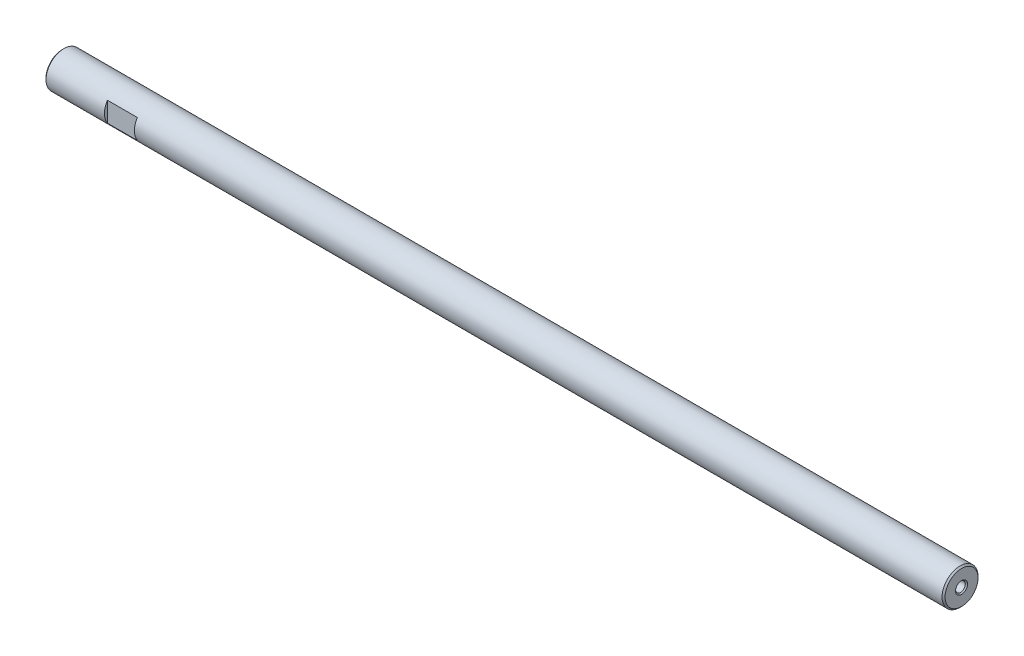
ISO-10303-21;
HEADER;
FILE_DESCRIPTION(('STEP AP214'),'2;1');
FILE_NAME('part.step','',(''),(''),'','','');
FILE_SCHEMA(('AUTOMOTIVE_DESIGN { 1 0 10303 214 1 1 1 1 }'));
ENDSEC;
DATA;
#1=APPLICATION_CONTEXT('core data for automotive mechanical design processes');
#2=APPLICATION_PROTOCOL_DEFINITION('international standard','automotive_design',2000,#1);
#3=PRODUCT_CONTEXT('',#1,'mechanical');
#4=PRODUCT('Part','Part','',(#3));
#5=PRODUCT_RELATED_PRODUCT_CATEGORY('part','',(#4));
#6=PRODUCT_DEFINITION_FORMATION('','',#4);
#7=PRODUCT_DEFINITION_CONTEXT('part definition',#1,'design');
#8=PRODUCT_DEFINITION('design','',#6,#7);
#9=PRODUCT_DEFINITION_SHAPE('','',#8);
#10=(LENGTH_UNIT() NAMED_UNIT(*) SI_UNIT(.MILLI.,.METRE.));
#11=(NAMED_UNIT(*) PLANE_ANGLE_UNIT() SI_UNIT($,.RADIAN.));
#12=(NAMED_UNIT(*) SI_UNIT($,.STERADIAN.) SOLID_ANGLE_UNIT());
#13=UNCERTAINTY_MEASURE_WITH_UNIT(LENGTH_MEASURE(1.E-05),#10,'distance_accuracy_value','');
#14=(GEOMETRIC_REPRESENTATION_CONTEXT(3) GLOBAL_UNCERTAINTY_ASSIGNED_CONTEXT((#13)) GLOBAL_UNIT_ASSIGNED_CONTEXT((#10,
#11,#12)) REPRESENTATION_CONTEXT('',''));
#15=CARTESIAN_POINT('',(0.,0.,0.));
#16=DIRECTION('',(0.,0.,1.));
#17=DIRECTION('',(1.,0.,0.));
#18=AXIS2_PLACEMENT_3D('',#15,#16,#17);
#19=CARTESIAN_POINT('',(300.,5.5,0.));
#20=DIRECTION('',(-1.,0.,0.));
#21=DIRECTION('',(0.,0.,1.));
#22=AXIS2_PLACEMENT_3D('',#19,#20,#21);
#23=PLANE('',#22);
#24=CARTESIAN_POINT('',(300.,0.,0.));
#25=DIRECTION('',(-1.,0.,0.));
#26=DIRECTION('',(0.,0.,1.));
#27=AXIS2_PLACEMENT_3D('',#24,#25,#26);
#28=CIRCLE('',#27,5.5);
#29=CARTESIAN_POINT('',(300.,0.,5.5));
#30=VERTEX_POINT('',#29);
#31=EDGE_CURVE('E118',#30,#30,#28,.T.);
#32=ORIENTED_EDGE('',*,*,#31,.F.);
#33=EDGE_LOOP('',(#32));
#34=FACE_BOUND('',#33,.T.);
#35=CARTESIAN_POINT('',(300.,0.,0.));
#36=DIRECTION('',(-1.,0.,0.));
#37=DIRECTION('',(0.,0.,1.));
#38=AXIS2_PLACEMENT_3D('',#35,#36,#37);
#39=CIRCLE('',#38,2.);
#40=CARTESIAN_POINT('',(300.,0.,2.));
#41=VERTEX_POINT('',#40);
#42=EDGE_CURVE('E106',#41,#41,#39,.T.);
#43=ORIENTED_EDGE('',*,*,#42,.T.);
#44=EDGE_LOOP('',(#43));
#45=FACE_BOUND('',#44,.T.);
#46=ADVANCED_FACE('F17',(#34,#45),#23,.F.);
#47=CARTESIAN_POINT('',(0.,0.,0.));
#48=DIRECTION('',(1.,0.,0.));
#49=DIRECTION('',(0.,0.,-1.));
#50=AXIS2_PLACEMENT_3D('',#47,#48,#49);
#51=PLANE('',#50);
#52=CARTESIAN_POINT('',(0.,0.,0.));
#53=DIRECTION('',(-1.,0.,0.));
#54=DIRECTION('',(0.,0.,1.));
#55=AXIS2_PLACEMENT_3D('',#52,#53,#54);
#56=CIRCLE('',#55,5.5);
#57=CARTESIAN_POINT('',(0.,0.,5.5));
#58=VERTEX_POINT('',#57);
#59=EDGE_CURVE('E72',#58,#58,#56,.T.);
#60=ORIENTED_EDGE('',*,*,#59,.T.);
#61=EDGE_LOOP('',(#60));
#62=FACE_BOUND('',#61,.T.);
#63=CARTESIAN_POINT('',(0.,0.,0.));
#64=DIRECTION('',(-1.,0.,0.));
#65=DIRECTION('',(0.,-1.,0.));
#66=AXIS2_PLACEMENT_3D('',#63,#64,#65);
#67=CIRCLE('',#66,2.);
#68=CARTESIAN_POINT('',(0.,-2.,0.));
#69=VERTEX_POINT('',#68);
#70=EDGE_CURVE('E115',#69,#69,#67,.T.);
#71=ORIENTED_EDGE('',*,*,#70,.F.);
#72=EDGE_LOOP('',(#71));
#73=FACE_BOUND('',#72,.T.);
#74=ADVANCED_FACE('F19',(#62,#73),#51,.F.);
#75=CARTESIAN_POINT('',(0.5,0.,0.));
#76=DIRECTION('',(1.,0.,0.));
#77=DIRECTION('',(0.,0.,-1.));
#78=AXIS2_PLACEMENT_3D('',#75,#76,#77);
#79=CONICAL_SURFACE('',#78,6.,0.785398163397448);
#80=ORIENTED_EDGE('',*,*,#59,.F.);
#81=EDGE_LOOP('',(#80));
#82=FACE_BOUND('',#81,.T.);
#83=CARTESIAN_POINT('',(0.5,0.,0.));
#84=DIRECTION('',(-1.,0.,0.));
#85=DIRECTION('',(0.,0.,1.));
#86=AXIS2_PLACEMENT_3D('',#83,#84,#85);
#87=CIRCLE('',#86,6.);
#88=CARTESIAN_POINT('',(0.5,0.,6.));
#89=VERTEX_POINT('',#88);
#90=EDGE_CURVE('E124',#89,#89,#87,.T.);
#91=ORIENTED_EDGE('',*,*,#90,.T.);
#92=EDGE_LOOP('',(#91));
#93=FACE_BOUND('',#92,.T.);
#94=ADVANCED_FACE('F132',(#82,#93),#79,.T.);
#95=CARTESIAN_POINT('',(300.,0.,0.));
#96=DIRECTION('',(-1.,0.,0.));
#97=DIRECTION('',(0.,0.,1.));
#98=AXIS2_PLACEMENT_3D('',#95,#96,#97);
#99=CYLINDRICAL_SURFACE('',#98,6.);
#100=CARTESIAN_POINT('',(30.,0.,0.));
#101=DIRECTION('',(1.,0.,0.));
#102=DIRECTION('',(0.,0.,-1.));
#103=AXIS2_PLACEMENT_3D('',#100,#101,#102);
#104=CIRCLE('',#103,6.);
#105=CARTESIAN_POINT('',(30.,-3.3166247903554,-5.));
#106=VERTEX_POINT('',#105);
#107=CARTESIAN_POINT('',(30.,3.3166247903554,-5.));
#108=VERTEX_POINT('',#107);
#109=EDGE_CURVE('E25',#106,#108,#104,.T.);
#110=ORIENTED_EDGE('',*,*,#109,.T.);
#111=DIRECTION('',(-1.,0.,0.));
#112=VECTOR('',#111,1.);
#113=CARTESIAN_POINT('',(300.,3.3166247903554,-5.));
#114=LINE('',#113,#112);
#115=CARTESIAN_POINT('',(20.,3.3166247903554,-5.));
#116=VERTEX_POINT('',#115);
#117=EDGE_CURVE('E11',#108,#116,#114,.T.);
#118=ORIENTED_EDGE('',*,*,#117,.T.);
#119=CARTESIAN_POINT('',(20.,0.,0.));
#120=DIRECTION('',(1.,0.,0.));
#121=DIRECTION('',(0.,0.,-1.));
#122=AXIS2_PLACEMENT_3D('',#119,#120,#121);
#123=CIRCLE('',#122,6.);
#124=CARTESIAN_POINT('',(20.,-3.3166247903554,-5.));
#125=VERTEX_POINT('',#124);
#126=EDGE_CURVE('E83',#125,#116,#123,.T.);
#127=ORIENTED_EDGE('',*,*,#126,.F.);
#128=DIRECTION('',(-1.,0.,0.));
#129=VECTOR('',#128,1.);
#130=CARTESIAN_POINT('',(300.,-3.3166247903554,-5.));
#131=LINE('',#130,#129);
#132=EDGE_CURVE('E85',#125,#106,#131,.F.);
#133=ORIENTED_EDGE('',*,*,#132,.T.);
#134=EDGE_LOOP('',(#110,#118,#127,#133));
#135=FACE_BOUND('',#134,.T.);
#136=CARTESIAN_POINT('',(30.,3.3166247903554,5.));
#137=VERTEX_POINT('',#136);
#138=CARTESIAN_POINT('',(30.,-3.3166247903554,5.));
#139=VERTEX_POINT('',#138);
#140=EDGE_CURVE('E81',#137,#139,#104,.T.);
#141=ORIENTED_EDGE('',*,*,#140,.T.);
#142=DIRECTION('',(-1.,0.,0.));
#143=VECTOR('',#142,1.);
#144=CARTESIAN_POINT('',(300.,-3.3166247903554,5.));
#145=LINE('',#144,#143);
#146=CARTESIAN_POINT('',(20.,-3.3166247903554,5.));
#147=VERTEX_POINT('',#146);
#148=EDGE_CURVE('E80',#139,#147,#145,.T.);
#149=ORIENTED_EDGE('',*,*,#148,.T.);
#150=CARTESIAN_POINT('',(20.,3.3166247903554,5.));
#151=VERTEX_POINT('',#150);
#152=EDGE_CURVE('E71',#151,#147,#123,.T.);
#153=ORIENTED_EDGE('',*,*,#152,.F.);
#154=DIRECTION('',(-1.,0.,0.));
#155=VECTOR('',#154,1.);
#156=CARTESIAN_POINT('',(300.,3.3166247903554,5.));
#157=LINE('',#156,#155);
#158=EDGE_CURVE('E63',#151,#137,#157,.F.);
#159=ORIENTED_EDGE('',*,*,#158,.T.);
#160=EDGE_LOOP('',(#141,#149,#153,#159));
#161=FACE_BOUND('',#160,.T.);
#162=ORIENTED_EDGE('',*,*,#90,.F.);
#163=EDGE_LOOP('',(#162));
#164=FACE_BOUND('',#163,.T.);
#165=CARTESIAN_POINT('',(299.5,0.,0.));
#166=DIRECTION('',(-1.,0.,0.));
#167=DIRECTION('',(0.,0.,1.));
#168=AXIS2_PLACEMENT_3D('',#165,#166,#167);
#169=CIRCLE('',#168,6.);
#170=CARTESIAN_POINT('',(299.5,0.,6.));
#171=VERTEX_POINT('',#170);
#172=EDGE_CURVE('E121',#171,#171,#169,.T.);
#173=ORIENTED_EDGE('',*,*,#172,.T.);
#174=EDGE_LOOP('',(#173));
#175=FACE_BOUND('',#174,.T.);
#176=ADVANCED_FACE('F78',(#135,#161,#164,#175),#99,.T.);
#177=CARTESIAN_POINT('',(300.,0.,0.));
#178=DIRECTION('',(-1.,0.,0.));
#179=DIRECTION('',(0.,0.,1.));
#180=AXIS2_PLACEMENT_3D('',#177,#178,#179);
#181=CONICAL_SURFACE('',#180,5.5,0.785398163397448);
#182=ORIENTED_EDGE('',*,*,#172,.F.);
#183=EDGE_LOOP('',(#182));
#184=FACE_BOUND('',#183,.T.);
#185=ORIENTED_EDGE('',*,*,#31,.T.);
#186=EDGE_LOOP('',(#185));
#187=FACE_BOUND('',#186,.T.);
#188=ADVANCED_FACE('F138',(#184,#187),#181,.T.);
#189=CARTESIAN_POINT('',(0.379,0.,0.));
#190=DIRECTION('',(-1.,0.,0.));
#191=DIRECTION('',(0.,-1.,0.));
#192=AXIS2_PLACEMENT_3D('',#189,#190,#191);
#193=CONICAL_SURFACE('',#192,1.621,0.785398163397449);
#194=ORIENTED_EDGE('',*,*,#70,.T.);
#195=EDGE_LOOP('',(#194));
#196=FACE_BOUND('',#195,.T.);
#197=CARTESIAN_POINT('',(0.379,0.,0.));
#198=DIRECTION('',(-1.,0.,0.));
#199=DIRECTION('',(0.,-1.,0.));
#200=AXIS2_PLACEMENT_3D('',#197,#198,#199);
#201=CIRCLE('',#200,1.621);
#202=CARTESIAN_POINT('',(0.379,-1.621,0.));
#203=VERTEX_POINT('',#202);
#204=EDGE_CURVE('E112',#203,#203,#201,.T.);
#205=ORIENTED_EDGE('',*,*,#204,.F.);
#206=EDGE_LOOP('',(#205));
#207=FACE_BOUND('',#206,.T.);
#208=ADVANCED_FACE('F144',(#196,#207),#193,.F.);
#209=CARTESIAN_POINT('',(9.9358847863564,0.,0.));
#210=DIRECTION('',(-1.,0.,0.));
#211=DIRECTION('',(0.,-1.,0.));
#212=AXIS2_PLACEMENT_3D('',#209,#210,#211);
#213=CYLINDRICAL_SURFACE('',#212,1.621);
#214=ORIENTED_EDGE('',*,*,#204,.T.);
#215=EDGE_LOOP('',(#214));
#216=FACE_BOUND('',#215,.T.);
#217=CARTESIAN_POINT('',(9.,0.,0.));
#218=DIRECTION('',(-1.,0.,0.));
#219=DIRECTION('',(0.,-1.,0.));
#220=AXIS2_PLACEMENT_3D('',#217,#218,#219);
#221=CIRCLE('',#220,1.621);
#222=CARTESIAN_POINT('',(9.,-1.621,0.));
#223=VERTEX_POINT('',#222);
#224=EDGE_CURVE('E109',#223,#223,#221,.T.);
#225=ORIENTED_EDGE('',*,*,#224,.F.);
#226=EDGE_LOOP('',(#225));
#227=FACE_BOUND('',#226,.T.);
#228=ADVANCED_FACE('F168',(#216,#227),#213,.F.);
#229=CARTESIAN_POINT('',(9.9358847863564,0.,0.));
#230=DIRECTION('',(-1.,0.,0.));
#231=DIRECTION('',(0.,-1.,0.));
#232=AXIS2_PLACEMENT_3D('',#229,#230,#231);
#233=CONICAL_SURFACE('',#232,0.,1.04719755119659);
#234=ORIENTED_EDGE('',*,*,#224,.T.);
#235=EDGE_LOOP('',(#234));
#236=FACE_BOUND('',#235,.T.);
#237=CARTESIAN_POINT('',(9.9358847863564,0.,0.));
#238=VERTEX_POINT('',#237);
#239=VERTEX_LOOP('',#238);
#240=FACE_BOUND('',#239,.T.);
#241=ADVANCED_FACE('F156',(#236,#240),#233,.F.);
#242=CARTESIAN_POINT('',(300.,0.,0.));
#243=DIRECTION('',(1.,0.,0.));
#244=DIRECTION('',(0.,0.,-1.));
#245=AXIS2_PLACEMENT_3D('',#242,#243,#244);
#246=CONICAL_SURFACE('',#245,2.,0.785398163397497);
#247=CARTESIAN_POINT('',(299.621,0.,0.));
#248=DIRECTION('',(-1.,0.,0.));
#249=DIRECTION('',(0.,0.,1.));
#250=AXIS2_PLACEMENT_3D('',#247,#248,#249);
#251=CIRCLE('',#250,1.621);
#252=CARTESIAN_POINT('',(299.621,0.,1.621));
#253=VERTEX_POINT('',#252);
#254=EDGE_CURVE('E103',#253,#253,#251,.T.);
#255=ORIENTED_EDGE('',*,*,#254,.T.);
#256=EDGE_LOOP('',(#255));
#257=FACE_BOUND('',#256,.T.);
#258=ORIENTED_EDGE('',*,*,#42,.F.);
#259=EDGE_LOOP('',(#258));
#260=FACE_BOUND('',#259,.T.);
#261=ADVANCED_FACE('F153',(#257,#260),#246,.F.);
#262=CARTESIAN_POINT('',(300.,0.,0.));
#263=DIRECTION('',(-1.,0.,0.));
#264=DIRECTION('',(0.,0.,1.));
#265=AXIS2_PLACEMENT_3D('',#262,#263,#264);
#266=CYLINDRICAL_SURFACE('',#265,1.621);
#267=CARTESIAN_POINT('',(291.,0.,0.));
#268=DIRECTION('',(-1.,0.,0.));
#269=DIRECTION('',(0.,0.,1.));
#270=AXIS2_PLACEMENT_3D('',#267,#268,#269);
#271=CIRCLE('',#270,1.621);
#272=CARTESIAN_POINT('',(291.,0.,1.621));
#273=VERTEX_POINT('',#272);
#274=EDGE_CURVE('E100',#273,#273,#271,.T.);
#275=ORIENTED_EDGE('',*,*,#274,.T.);
#276=EDGE_LOOP('',(#275));
#277=FACE_BOUND('',#276,.T.);
#278=ORIENTED_EDGE('',*,*,#254,.F.);
#279=EDGE_LOOP('',(#278));
#280=FACE_BOUND('',#279,.T.);
#281=ADVANCED_FACE('F155',(#277,#280),#266,.F.);
#282=CARTESIAN_POINT('',(291.,0.,0.));
#283=DIRECTION('',(1.,0.,0.));
#284=DIRECTION('',(0.,0.,-1.));
#285=AXIS2_PLACEMENT_3D('',#282,#283,#284);
#286=CONICAL_SURFACE('',#285,1.621,1.04719755119494);
#287=CARTESIAN_POINT('',(290.06411521364,0.,0.));
#288=VERTEX_POINT('',#287);
#289=VERTEX_LOOP('',#288);
#290=FACE_BOUND('',#289,.T.);
#291=ORIENTED_EDGE('',*,*,#274,.F.);
#292=EDGE_LOOP('',(#291));
#293=FACE_BOUND('',#292,.T.);
#294=ADVANCED_FACE('F165',(#290,#293),#286,.F.);
#295=CARTESIAN_POINT('',(30.,3.8327535793474,5.));
#296=DIRECTION('',(0.,0.,-1.));
#297=DIRECTION('',(-1.,0.,0.));
#298=AXIS2_PLACEMENT_3D('',#295,#296,#297);
#299=PLANE('',#298);
#300=DIRECTION('',(0.,-1.,0.));
#301=VECTOR('',#300,1.);
#302=CARTESIAN_POINT('',(30.,3.8327535793474,5.));
#303=LINE('',#302,#301);
#304=EDGE_CURVE('E40',#137,#139,#303,.T.);
#305=ORIENTED_EDGE('',*,*,#304,.F.);
#306=ORIENTED_EDGE('',*,*,#158,.F.);
#307=DIRECTION('',(0.,-1.,0.));
#308=VECTOR('',#307,1.);
#309=CARTESIAN_POINT('',(20.,3.8327535793474,5.));
#310=LINE('',#309,#308);
#311=EDGE_CURVE('E66',#151,#147,#310,.T.);
#312=ORIENTED_EDGE('',*,*,#311,.T.);
#313=ORIENTED_EDGE('',*,*,#148,.F.);
#314=EDGE_LOOP('',(#305,#306,#312,#313));
#315=FACE_BOUND('',#314,.T.);
#316=ADVANCED_FACE('F65',(#315),#299,.F.);
#317=CARTESIAN_POINT('',(20.,-12.,12.));
#318=DIRECTION('',(1.,0.,0.));
#319=DIRECTION('',(0.,0.,-1.));
#320=AXIS2_PLACEMENT_3D('',#317,#318,#319);
#321=PLANE('',#320);
#322=ORIENTED_EDGE('',*,*,#152,.T.);
#323=ORIENTED_EDGE('',*,*,#311,.F.);
#324=EDGE_LOOP('',(#322,#323));
#325=FACE_BOUND('',#324,.T.);
#326=ADVANCED_FACE('F75',(#325),#321,.T.);
#327=CARTESIAN_POINT('',(30.,-12.,12.));
#328=DIRECTION('',(1.,0.,0.));
#329=DIRECTION('',(0.,0.,-1.));
#330=AXIS2_PLACEMENT_3D('',#327,#328,#329);
#331=PLANE('',#330);
#332=ORIENTED_EDGE('',*,*,#304,.T.);
#333=ORIENTED_EDGE('',*,*,#140,.F.);
#334=EDGE_LOOP('',(#332,#333));
#335=FACE_BOUND('',#334,.T.);
#336=ADVANCED_FACE('F264',(#335),#331,.F.);
#337=DIRECTION('',(0.,1.,0.));
#338=VECTOR('',#337,1.);
#339=CARTESIAN_POINT('',(30.,-3.8327535793474,-5.));
#340=LINE('',#339,#338);
#341=EDGE_CURVE('E32',#106,#108,#340,.T.);
#342=ORIENTED_EDGE('',*,*,#341,.T.);
#343=ORIENTED_EDGE('',*,*,#109,.F.);
#344=EDGE_LOOP('',(#342,#343));
#345=FACE_BOUND('',#344,.T.);
#346=ADVANCED_FACE('F273',(#345),#331,.F.);
#347=ORIENTED_EDGE('',*,*,#126,.T.);
#348=DIRECTION('',(0.,1.,0.));
#349=VECTOR('',#348,1.);
#350=CARTESIAN_POINT('',(20.,-3.8327535793474,-5.));
#351=LINE('',#350,#349);
#352=EDGE_CURVE('E76',#125,#116,#351,.T.);
#353=ORIENTED_EDGE('',*,*,#352,.F.);
#354=EDGE_LOOP('',(#347,#353));
#355=FACE_BOUND('',#354,.T.);
#356=ADVANCED_FACE('F95',(#355),#321,.T.);
#357=CARTESIAN_POINT('',(30.,-3.8327535793474,-5.));
#358=DIRECTION('',(0.,0.,1.));
#359=DIRECTION('',(1.,0.,0.));
#360=AXIS2_PLACEMENT_3D('',#357,#358,#359);
#361=PLANE('',#360);
#362=ORIENTED_EDGE('',*,*,#341,.F.);
#363=ORIENTED_EDGE('',*,*,#132,.F.);
#364=ORIENTED_EDGE('',*,*,#352,.T.);
#365=ORIENTED_EDGE('',*,*,#117,.F.);
#366=EDGE_LOOP('',(#362,#363,#364,#365));
#367=FACE_BOUND('',#366,.T.);
#368=ADVANCED_FACE('F94',(#367),#361,.F.);
#369=CLOSED_SHELL('',(#46,#74,#94,#176,#188,#208,#228,#241,#261,#281,#294,#316,#326,#336,#346,
#356,#368));
#370=MANIFOLD_SOLID_BREP('B1',#369);
#371=ADVANCED_BREP_SHAPE_REPRESENTATION('',(#18,#370),#14);
#372=SHAPE_DEFINITION_REPRESENTATION(#9,#371);
ENDSEC;
END-ISO-10303-21;
